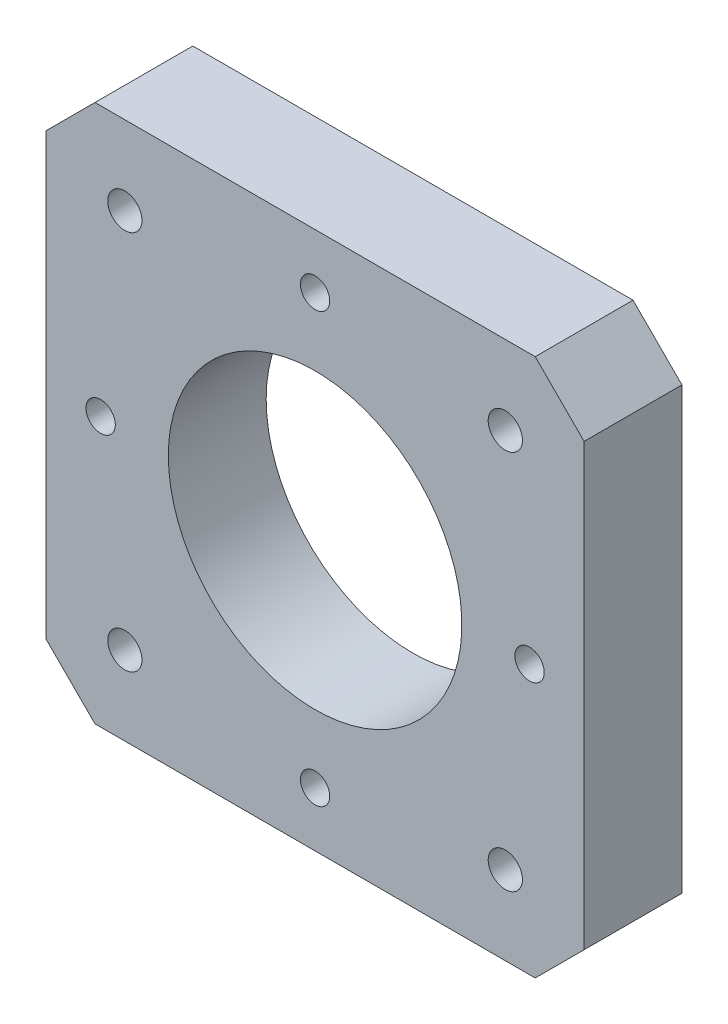
ISO-10303-21;
HEADER;
FILE_DESCRIPTION(('STEP AP214'),'2;1');
FILE_NAME('part.step','',(''),(''),'','','');
FILE_SCHEMA(('AUTOMOTIVE_DESIGN { 1 0 10303 214 1 1 1 1 }'));
ENDSEC;
DATA;
#1=APPLICATION_CONTEXT('core data for automotive mechanical design processes');
#2=APPLICATION_PROTOCOL_DEFINITION('international standard','automotive_design',2000,#1);
#3=PRODUCT_CONTEXT('',#1,'mechanical');
#4=PRODUCT('Part','Part','',(#3));
#5=PRODUCT_RELATED_PRODUCT_CATEGORY('part','',(#4));
#6=PRODUCT_DEFINITION_FORMATION('','',#4);
#7=PRODUCT_DEFINITION_CONTEXT('part definition',#1,'design');
#8=PRODUCT_DEFINITION('design','',#6,#7);
#9=PRODUCT_DEFINITION_SHAPE('','',#8);
#10=(LENGTH_UNIT() NAMED_UNIT(*) SI_UNIT(.MILLI.,.METRE.));
#11=(NAMED_UNIT(*) PLANE_ANGLE_UNIT() SI_UNIT($,.RADIAN.));
#12=(NAMED_UNIT(*) SI_UNIT($,.STERADIAN.) SOLID_ANGLE_UNIT());
#13=UNCERTAINTY_MEASURE_WITH_UNIT(LENGTH_MEASURE(1.E-05),#10,'distance_accuracy_value','');
#14=(GEOMETRIC_REPRESENTATION_CONTEXT(3) GLOBAL_UNCERTAINTY_ASSIGNED_CONTEXT((#13)) GLOBAL_UNIT_ASSIGNED_CONTEXT((#10,
#11,#12)) REPRESENTATION_CONTEXT('',''));
#15=CARTESIAN_POINT('',(0.,0.,0.));
#16=DIRECTION('',(0.,0.,1.));
#17=DIRECTION('',(1.,0.,0.));
#18=AXIS2_PLACEMENT_3D('',#15,#16,#17);
#19=CARTESIAN_POINT('',(-21.920310216783,0.,10.));
#20=DIRECTION('',(0.,0.,-1.));
#21=DIRECTION('',(-1.,0.,0.));
#22=AXIS2_PLACEMENT_3D('',#19,#20,#21);
#23=CYLINDRICAL_SURFACE('',#22,1.5);
#24=CARTESIAN_POINT('',(-21.920310216783,0.,10.));
#25=DIRECTION('',(0.,0.,-1.));
#26=DIRECTION('',(-1.,0.,0.));
#27=AXIS2_PLACEMENT_3D('',#24,#25,#26);
#28=CIRCLE('',#27,1.5);
#29=CARTESIAN_POINT('',(-23.420310216783,0.,10.));
#30=VERTEX_POINT('',#29);
#31=EDGE_CURVE('E155',#30,#30,#28,.T.);
#32=ORIENTED_EDGE('',*,*,#31,.F.);
#33=EDGE_LOOP('',(#32));
#34=FACE_BOUND('',#33,.T.);
#35=CARTESIAN_POINT('',(-21.920310216783,0.,6.));
#36=DIRECTION('',(0.,0.,-1.));
#37=DIRECTION('',(-1.,0.,0.));
#38=AXIS2_PLACEMENT_3D('',#35,#36,#37);
#39=CIRCLE('',#38,1.5);
#40=CARTESIAN_POINT('',(-23.420310216783,0.,6.));
#41=VERTEX_POINT('',#40);
#42=EDGE_CURVE('E152',#41,#41,#39,.F.);
#43=ORIENTED_EDGE('',*,*,#42,.F.);
#44=EDGE_LOOP('',(#43));
#45=FACE_BOUND('',#44,.T.);
#46=ADVANCED_FACE('F40',(#34,#45),#23,.F.);
#47=CARTESIAN_POINT('',(0.,-21.920310216783,10.));
#48=DIRECTION('',(0.,0.,-1.));
#49=DIRECTION('',(-1.,0.,0.));
#50=AXIS2_PLACEMENT_3D('',#47,#48,#49);
#51=CYLINDRICAL_SURFACE('',#50,1.5);
#52=CARTESIAN_POINT('',(0.,-21.920310216783,10.));
#53=DIRECTION('',(0.,0.,-1.));
#54=DIRECTION('',(-1.,0.,0.));
#55=AXIS2_PLACEMENT_3D('',#52,#53,#54);
#56=CIRCLE('',#55,1.5);
#57=CARTESIAN_POINT('',(-1.5,-21.920310216783,10.));
#58=VERTEX_POINT('',#57);
#59=EDGE_CURVE('E222',#58,#58,#56,.T.);
#60=ORIENTED_EDGE('',*,*,#59,.F.);
#61=EDGE_LOOP('',(#60));
#62=FACE_BOUND('',#61,.T.);
#63=CARTESIAN_POINT('',(0.,-21.920310216783,6.));
#64=DIRECTION('',(0.,0.,-1.));
#65=DIRECTION('',(-1.,0.,0.));
#66=AXIS2_PLACEMENT_3D('',#63,#64,#65);
#67=CIRCLE('',#66,1.5);
#68=CARTESIAN_POINT('',(-1.5,-21.920310216783,6.));
#69=VERTEX_POINT('',#68);
#70=EDGE_CURVE('E149',#69,#69,#67,.F.);
#71=ORIENTED_EDGE('',*,*,#70,.F.);
#72=EDGE_LOOP('',(#71));
#73=FACE_BOUND('',#72,.T.);
#74=ADVANCED_FACE('F295',(#62,#73),#51,.F.);
#75=CARTESIAN_POINT('',(21.920310216783,0.,10.));
#76=DIRECTION('',(0.,0.,-1.));
#77=DIRECTION('',(-1.,0.,0.));
#78=AXIS2_PLACEMENT_3D('',#75,#76,#77);
#79=CYLINDRICAL_SURFACE('',#78,1.5);
#80=CARTESIAN_POINT('',(21.920310216783,0.,10.));
#81=DIRECTION('',(0.,0.,-1.));
#82=DIRECTION('',(-1.,0.,0.));
#83=AXIS2_PLACEMENT_3D('',#80,#81,#82);
#84=CIRCLE('',#83,1.5);
#85=CARTESIAN_POINT('',(20.420310216783,0.,10.));
#86=VERTEX_POINT('',#85);
#87=EDGE_CURVE('E225',#86,#86,#84,.T.);
#88=ORIENTED_EDGE('',*,*,#87,.F.);
#89=EDGE_LOOP('',(#88));
#90=FACE_BOUND('',#89,.T.);
#91=CARTESIAN_POINT('',(21.920310216783,0.,6.));
#92=DIRECTION('',(0.,0.,-1.));
#93=DIRECTION('',(-1.,0.,0.));
#94=AXIS2_PLACEMENT_3D('',#91,#92,#93);
#95=CIRCLE('',#94,1.5);
#96=CARTESIAN_POINT('',(20.420310216783,0.,6.));
#97=VERTEX_POINT('',#96);
#98=EDGE_CURVE('E145',#97,#97,#95,.F.);
#99=ORIENTED_EDGE('',*,*,#98,.F.);
#100=EDGE_LOOP('',(#99));
#101=FACE_BOUND('',#100,.T.);
#102=ADVANCED_FACE('F300',(#90,#101),#79,.F.);
#103=CARTESIAN_POINT('',(0.,21.920310216783,10.));
#104=DIRECTION('',(0.,0.,-1.));
#105=DIRECTION('',(-1.,0.,0.));
#106=AXIS2_PLACEMENT_3D('',#103,#104,#105);
#107=CYLINDRICAL_SURFACE('',#106,1.5);
#108=CARTESIAN_POINT('',(0.,21.920310216783,10.));
#109=DIRECTION('',(0.,0.,-1.));
#110=DIRECTION('',(-1.,0.,0.));
#111=AXIS2_PLACEMENT_3D('',#108,#109,#110);
#112=CIRCLE('',#111,1.5);
#113=CARTESIAN_POINT('',(-1.5,21.920310216783,10.));
#114=VERTEX_POINT('',#113);
#115=EDGE_CURVE('E217',#114,#114,#112,.T.);
#116=ORIENTED_EDGE('',*,*,#115,.F.);
#117=EDGE_LOOP('',(#116));
#118=FACE_BOUND('',#117,.T.);
#119=CARTESIAN_POINT('',(0.,21.920310216783,6.));
#120=DIRECTION('',(0.,0.,-1.));
#121=DIRECTION('',(-1.,0.,0.));
#122=AXIS2_PLACEMENT_3D('',#119,#120,#121);
#123=CIRCLE('',#122,1.5);
#124=CARTESIAN_POINT('',(-1.5,21.920310216783,6.));
#125=VERTEX_POINT('',#124);
#126=EDGE_CURVE('E142',#125,#125,#123,.F.);
#127=ORIENTED_EDGE('',*,*,#126,.F.);
#128=EDGE_LOOP('',(#127));
#129=FACE_BOUND('',#128,.T.);
#130=ADVANCED_FACE('F308',(#118,#129),#107,.F.);
#131=CARTESIAN_POINT('',(0.,0.,10.));
#132=DIRECTION('',(0.,0.,1.));
#133=DIRECTION('',(1.,0.,0.));
#134=AXIS2_PLACEMENT_3D('',#131,#132,#133);
#135=PLANE('',#134);
#136=ORIENTED_EDGE('',*,*,#115,.T.);
#137=EDGE_LOOP('',(#136));
#138=FACE_BOUND('',#137,.T.);
#139=ORIENTED_EDGE('',*,*,#87,.T.);
#140=EDGE_LOOP('',(#139));
#141=FACE_BOUND('',#140,.T.);
#142=ORIENTED_EDGE('',*,*,#59,.T.);
#143=EDGE_LOOP('',(#142));
#144=FACE_BOUND('',#143,.T.);
#145=ORIENTED_EDGE('',*,*,#31,.T.);
#146=EDGE_LOOP('',(#145));
#147=FACE_BOUND('',#146,.T.);
#148=CARTESIAN_POINT('',(0.,0.,10.));
#149=DIRECTION('',(0.,0.,-1.));
#150=DIRECTION('',(-1.,0.,0.));
#151=AXIS2_PLACEMENT_3D('',#148,#149,#150);
#152=CIRCLE('',#151,15.);
#153=CARTESIAN_POINT('',(-15.,0.,10.));
#154=VERTEX_POINT('',#153);
#155=EDGE_CURVE('E211',#154,#154,#152,.T.);
#156=ORIENTED_EDGE('',*,*,#155,.T.);
#157=EDGE_LOOP('',(#156));
#158=FACE_BOUND('',#157,.T.);
#159=CARTESIAN_POINT('',(-19.4454364826301,-19.4454364826301,10.));
#160=DIRECTION('',(0.,0.,1.));
#161=DIRECTION('',(1.,0.,0.));
#162=AXIS2_PLACEMENT_3D('',#159,#160,#161);
#163=CIRCLE('',#162,1.75);
#164=CARTESIAN_POINT('',(-17.6954364826301,-19.4454364826301,10.));
#165=VERTEX_POINT('',#164);
#166=EDGE_CURVE('E199',#165,#165,#163,.T.);
#167=ORIENTED_EDGE('',*,*,#166,.F.);
#168=EDGE_LOOP('',(#167));
#169=FACE_BOUND('',#168,.T.);
#170=CARTESIAN_POINT('',(19.4454364826301,19.4454364826301,10.));
#171=DIRECTION('',(0.,0.,1.));
#172=DIRECTION('',(1.,0.,0.));
#173=AXIS2_PLACEMENT_3D('',#170,#171,#172);
#174=CIRCLE('',#173,1.75);
#175=CARTESIAN_POINT('',(21.1954364826301,19.4454364826301,10.));
#176=VERTEX_POINT('',#175);
#177=EDGE_CURVE('E182',#176,#176,#174,.T.);
#178=ORIENTED_EDGE('',*,*,#177,.F.);
#179=EDGE_LOOP('',(#178));
#180=FACE_BOUND('',#179,.T.);
#181=DIRECTION('',(0.,-1.,0.));
#182=VECTOR('',#181,1.);
#183=CARTESIAN_POINT('',(-27.5,27.5,10.));
#184=LINE('',#183,#182);
#185=CARTESIAN_POINT('',(-27.5,22.5,10.));
#186=VERTEX_POINT('',#185);
#187=CARTESIAN_POINT('',(-27.5,-22.5,10.));
#188=VERTEX_POINT('',#187);
#189=EDGE_CURVE('E186',#186,#188,#184,.T.);
#190=ORIENTED_EDGE('',*,*,#189,.T.);
#191=DIRECTION('',(-0.707106781186547,0.707106781186549,0.));
#192=VECTOR('',#191,1.);
#193=CARTESIAN_POINT('',(-25.,-25.,10.));
#194=LINE('',#193,#192);
#195=CARTESIAN_POINT('',(-22.5,-27.5,10.));
#196=VERTEX_POINT('',#195);
#197=EDGE_CURVE('E169',#188,#196,#194,.F.);
#198=ORIENTED_EDGE('',*,*,#197,.T.);
#199=DIRECTION('',(1.,0.,0.));
#200=VECTOR('',#199,1.);
#201=CARTESIAN_POINT('',(-27.5,-27.5,10.));
#202=LINE('',#201,#200);
#203=CARTESIAN_POINT('',(22.5,-27.5,10.));
#204=VERTEX_POINT('',#203);
#205=EDGE_CURVE('E126',#196,#204,#202,.T.);
#206=ORIENTED_EDGE('',*,*,#205,.T.);
#207=DIRECTION('',(-0.707106781186549,-0.707106781186546,0.));
#208=VECTOR('',#207,1.);
#209=CARTESIAN_POINT('',(25.,-25.,10.));
#210=LINE('',#209,#208);
#211=CARTESIAN_POINT('',(27.5,-22.5,10.));
#212=VERTEX_POINT('',#211);
#213=EDGE_CURVE('E167',#204,#212,#210,.F.);
#214=ORIENTED_EDGE('',*,*,#213,.T.);
#215=DIRECTION('',(0.,1.,0.));
#216=VECTOR('',#215,1.);
#217=CARTESIAN_POINT('',(27.5,27.5,10.));
#218=LINE('',#217,#216);
#219=CARTESIAN_POINT('',(27.5,22.5,10.));
#220=VERTEX_POINT('',#219);
#221=EDGE_CURVE('E133',#212,#220,#218,.T.);
#222=ORIENTED_EDGE('',*,*,#221,.T.);
#223=DIRECTION('',(0.707106781186546,-0.707106781186549,0.));
#224=VECTOR('',#223,1.);
#225=CARTESIAN_POINT('',(25.0000000000001,24.9999999999999,10.));
#226=LINE('',#225,#224);
#227=CARTESIAN_POINT('',(22.5,27.5,10.));
#228=VERTEX_POINT('',#227);
#229=EDGE_CURVE('E61',#220,#228,#226,.F.);
#230=ORIENTED_EDGE('',*,*,#229,.T.);
#231=DIRECTION('',(-1.,0.,0.));
#232=VECTOR('',#231,1.);
#233=CARTESIAN_POINT('',(-27.5,27.5,10.));
#234=LINE('',#233,#232);
#235=CARTESIAN_POINT('',(-22.5,27.5,10.));
#236=VERTEX_POINT('',#235);
#237=EDGE_CURVE('E136',#228,#236,#234,.T.);
#238=ORIENTED_EDGE('',*,*,#237,.T.);
#239=DIRECTION('',(0.707106781186549,0.707106781186546,0.));
#240=VECTOR('',#239,1.);
#241=CARTESIAN_POINT('',(-24.9999999999999,25.0000000000001,10.));
#242=LINE('',#241,#240);
#243=EDGE_CURVE('E165',#236,#186,#242,.F.);
#244=ORIENTED_EDGE('',*,*,#243,.T.);
#245=EDGE_LOOP('',(#190,#198,#206,#214,#222,#230,#238,#244));
#246=FACE_BOUND('',#245,.T.);
#247=CARTESIAN_POINT('',(-19.4454364826301,19.4454364826301,10.));
#248=DIRECTION('',(0.,0.,1.));
#249=DIRECTION('',(1.,0.,0.));
#250=AXIS2_PLACEMENT_3D('',#247,#248,#249);
#251=CIRCLE('',#250,1.75);
#252=CARTESIAN_POINT('',(-17.6954364826301,19.4454364826301,10.));
#253=VERTEX_POINT('',#252);
#254=EDGE_CURVE('E193',#253,#253,#251,.T.);
#255=ORIENTED_EDGE('',*,*,#254,.F.);
#256=EDGE_LOOP('',(#255));
#257=FACE_BOUND('',#256,.T.);
#258=CARTESIAN_POINT('',(19.4454364826301,-19.4454364826301,10.));
#259=DIRECTION('',(0.,0.,1.));
#260=DIRECTION('',(1.,0.,0.));
#261=AXIS2_PLACEMENT_3D('',#258,#259,#260);
#262=CIRCLE('',#261,1.75);
#263=CARTESIAN_POINT('',(21.1954364826301,-19.4454364826301,10.));
#264=VERTEX_POINT('',#263);
#265=EDGE_CURVE('E205',#264,#264,#262,.T.);
#266=ORIENTED_EDGE('',*,*,#265,.F.);
#267=EDGE_LOOP('',(#266));
#268=FACE_BOUND('',#267,.T.);
#269=ADVANCED_FACE('F266',(#138,#141,#144,#147,#158,#169,#180,#246,#257,#268),#135,.T.);
#270=CARTESIAN_POINT('',(0.,0.,0.));
#271=DIRECTION('',(0.,0.,1.));
#272=DIRECTION('',(1.,0.,0.));
#273=AXIS2_PLACEMENT_3D('',#270,#271,#272);
#274=PLANE('',#273);
#275=CARTESIAN_POINT('',(-21.920310216783,0.,0.));
#276=DIRECTION('',(0.,0.,-1.));
#277=DIRECTION('',(-1.,0.,0.));
#278=AXIS2_PLACEMENT_3D('',#275,#276,#277);
#279=CIRCLE('',#278,3.25);
#280=CARTESIAN_POINT('',(-25.170310216783,0.,0.));
#281=VERTEX_POINT('',#280);
#282=EDGE_CURVE('E248',#281,#281,#279,.T.);
#283=ORIENTED_EDGE('',*,*,#282,.F.);
#284=EDGE_LOOP('',(#283));
#285=FACE_BOUND('',#284,.T.);
#286=CARTESIAN_POINT('',(0.,-21.920310216783,0.));
#287=DIRECTION('',(0.,0.,-1.));
#288=DIRECTION('',(-1.,0.,0.));
#289=AXIS2_PLACEMENT_3D('',#286,#287,#288);
#290=CIRCLE('',#289,3.25);
#291=CARTESIAN_POINT('',(-3.25,-21.920310216783,0.));
#292=VERTEX_POINT('',#291);
#293=EDGE_CURVE('E242',#292,#292,#290,.T.);
#294=ORIENTED_EDGE('',*,*,#293,.F.);
#295=EDGE_LOOP('',(#294));
#296=FACE_BOUND('',#295,.T.);
#297=CARTESIAN_POINT('',(21.920310216783,0.,0.));
#298=DIRECTION('',(0.,0.,-1.));
#299=DIRECTION('',(-1.,0.,0.));
#300=AXIS2_PLACEMENT_3D('',#297,#298,#299);
#301=CIRCLE('',#300,3.25);
#302=CARTESIAN_POINT('',(18.670310216783,0.,0.));
#303=VERTEX_POINT('',#302);
#304=EDGE_CURVE('E236',#303,#303,#301,.T.);
#305=ORIENTED_EDGE('',*,*,#304,.F.);
#306=EDGE_LOOP('',(#305));
#307=FACE_BOUND('',#306,.T.);
#308=CARTESIAN_POINT('',(0.,21.920310216783,0.));
#309=DIRECTION('',(0.,0.,-1.));
#310=DIRECTION('',(-1.,0.,0.));
#311=AXIS2_PLACEMENT_3D('',#308,#309,#310);
#312=CIRCLE('',#311,3.25);
#313=CARTESIAN_POINT('',(-3.25,21.920310216783,0.));
#314=VERTEX_POINT('',#313);
#315=EDGE_CURVE('E230',#314,#314,#312,.T.);
#316=ORIENTED_EDGE('',*,*,#315,.F.);
#317=EDGE_LOOP('',(#316));
#318=FACE_BOUND('',#317,.T.);
#319=CARTESIAN_POINT('',(0.,0.,0.));
#320=DIRECTION('',(0.,0.,-1.));
#321=DIRECTION('',(-1.,0.,0.));
#322=AXIS2_PLACEMENT_3D('',#319,#320,#321);
#323=CIRCLE('',#322,15.);
#324=CARTESIAN_POINT('',(-15.,0.,0.));
#325=VERTEX_POINT('',#324);
#326=EDGE_CURVE('E214',#325,#325,#323,.T.);
#327=ORIENTED_EDGE('',*,*,#326,.F.);
#328=EDGE_LOOP('',(#327));
#329=FACE_BOUND('',#328,.T.);
#330=DIRECTION('',(1.,0.,0.));
#331=VECTOR('',#330,1.);
#332=CARTESIAN_POINT('',(-27.5,-27.5,0.));
#333=LINE('',#332,#331);
#334=CARTESIAN_POINT('',(-22.5,-27.5,0.));
#335=VERTEX_POINT('',#334);
#336=CARTESIAN_POINT('',(22.5,-27.5,0.));
#337=VERTEX_POINT('',#336);
#338=EDGE_CURVE('E123',#335,#337,#333,.T.);
#339=ORIENTED_EDGE('',*,*,#338,.F.);
#340=DIRECTION('',(0.707106781186547,-0.707106781186549,0.));
#341=VECTOR('',#340,1.);
#342=CARTESIAN_POINT('',(-22.5,-27.5,0.));
#343=LINE('',#342,#341);
#344=CARTESIAN_POINT('',(-27.5,-22.5,0.));
#345=VERTEX_POINT('',#344);
#346=EDGE_CURVE('E106',#335,#345,#343,.F.);
#347=ORIENTED_EDGE('',*,*,#346,.T.);
#348=DIRECTION('',(0.,-1.,0.));
#349=VECTOR('',#348,1.);
#350=CARTESIAN_POINT('',(-27.5,27.5,0.));
#351=LINE('',#350,#349);
#352=CARTESIAN_POINT('',(-27.5,22.5,0.));
#353=VERTEX_POINT('',#352);
#354=EDGE_CURVE('E134',#353,#345,#351,.T.);
#355=ORIENTED_EDGE('',*,*,#354,.F.);
#356=DIRECTION('',(-0.707106781186549,-0.707106781186546,0.));
#357=VECTOR('',#356,1.);
#358=CARTESIAN_POINT('',(-27.5,22.5,0.));
#359=LINE('',#358,#357);
#360=CARTESIAN_POINT('',(-22.5,27.5,0.));
#361=VERTEX_POINT('',#360);
#362=EDGE_CURVE('E158',#353,#361,#359,.F.);
#363=ORIENTED_EDGE('',*,*,#362,.T.);
#364=DIRECTION('',(-1.,0.,0.));
#365=VECTOR('',#364,1.);
#366=CARTESIAN_POINT('',(-27.5,27.5,0.));
#367=LINE('',#366,#365);
#368=CARTESIAN_POINT('',(22.5,27.5,0.));
#369=VERTEX_POINT('',#368);
#370=EDGE_CURVE('E138',#369,#361,#367,.T.);
#371=ORIENTED_EDGE('',*,*,#370,.F.);
#372=DIRECTION('',(-0.707106781186546,0.707106781186549,0.));
#373=VECTOR('',#372,1.);
#374=CARTESIAN_POINT('',(22.5,27.5,0.));
#375=LINE('',#374,#373);
#376=CARTESIAN_POINT('',(27.5,22.5,0.));
#377=VERTEX_POINT('',#376);
#378=EDGE_CURVE('E127',#369,#377,#375,.F.);
#379=ORIENTED_EDGE('',*,*,#378,.T.);
#380=DIRECTION('',(0.,1.,0.));
#381=VECTOR('',#380,1.);
#382=CARTESIAN_POINT('',(27.5,27.5,0.));
#383=LINE('',#382,#381);
#384=CARTESIAN_POINT('',(27.5,-22.5,0.));
#385=VERTEX_POINT('',#384);
#386=EDGE_CURVE('E181',#385,#377,#383,.T.);
#387=ORIENTED_EDGE('',*,*,#386,.F.);
#388=DIRECTION('',(0.707106781186549,0.707106781186546,0.));
#389=VECTOR('',#388,1.);
#390=CARTESIAN_POINT('',(27.5,-22.5,0.));
#391=LINE('',#390,#389);
#392=EDGE_CURVE('E117',#385,#337,#391,.F.);
#393=ORIENTED_EDGE('',*,*,#392,.T.);
#394=EDGE_LOOP('',(#339,#347,#355,#363,#371,#379,#387,#393));
#395=FACE_BOUND('',#394,.T.);
#396=CARTESIAN_POINT('',(19.4454364826301,19.4454364826301,0.));
#397=DIRECTION('',(0.,0.,1.));
#398=DIRECTION('',(1.,0.,0.));
#399=AXIS2_PLACEMENT_3D('',#396,#397,#398);
#400=CIRCLE('',#399,1.75);
#401=CARTESIAN_POINT('',(21.1954364826301,19.4454364826301,0.));
#402=VERTEX_POINT('',#401);
#403=EDGE_CURVE('E190',#402,#402,#400,.T.);
#404=ORIENTED_EDGE('',*,*,#403,.T.);
#405=EDGE_LOOP('',(#404));
#406=FACE_BOUND('',#405,.T.);
#407=CARTESIAN_POINT('',(-19.4454364826301,19.4454364826301,0.));
#408=DIRECTION('',(0.,0.,1.));
#409=DIRECTION('',(1.,0.,0.));
#410=AXIS2_PLACEMENT_3D('',#407,#408,#409);
#411=CIRCLE('',#410,1.75);
#412=CARTESIAN_POINT('',(-17.6954364826301,19.4454364826301,0.));
#413=VERTEX_POINT('',#412);
#414=EDGE_CURVE('E196',#413,#413,#411,.T.);
#415=ORIENTED_EDGE('',*,*,#414,.T.);
#416=EDGE_LOOP('',(#415));
#417=FACE_BOUND('',#416,.T.);
#418=CARTESIAN_POINT('',(-19.4454364826301,-19.4454364826301,0.));
#419=DIRECTION('',(0.,0.,1.));
#420=DIRECTION('',(1.,0.,0.));
#421=AXIS2_PLACEMENT_3D('',#418,#419,#420);
#422=CIRCLE('',#421,1.75);
#423=CARTESIAN_POINT('',(-17.6954364826301,-19.4454364826301,0.));
#424=VERTEX_POINT('',#423);
#425=EDGE_CURVE('E202',#424,#424,#422,.T.);
#426=ORIENTED_EDGE('',*,*,#425,.T.);
#427=EDGE_LOOP('',(#426));
#428=FACE_BOUND('',#427,.T.);
#429=CARTESIAN_POINT('',(19.4454364826301,-19.4454364826301,0.));
#430=DIRECTION('',(0.,0.,1.));
#431=DIRECTION('',(1.,0.,0.));
#432=AXIS2_PLACEMENT_3D('',#429,#430,#431);
#433=CIRCLE('',#432,1.75);
#434=CARTESIAN_POINT('',(21.1954364826301,-19.4454364826301,0.));
#435=VERTEX_POINT('',#434);
#436=EDGE_CURVE('E208',#435,#435,#433,.T.);
#437=ORIENTED_EDGE('',*,*,#436,.T.);
#438=EDGE_LOOP('',(#437));
#439=FACE_BOUND('',#438,.T.);
#440=ADVANCED_FACE('F130',(#285,#296,#307,#318,#329,#395,#406,#417,#428,#439),#274,.F.);
#441=CARTESIAN_POINT('',(27.5,27.5,10.));
#442=DIRECTION('',(-1.,0.,0.));
#443=DIRECTION('',(0.,-1.,0.));
#444=AXIS2_PLACEMENT_3D('',#441,#442,#443);
#445=PLANE('',#444);
#446=ORIENTED_EDGE('',*,*,#221,.F.);
#447=DIRECTION('',(0.,0.,-1.));
#448=VECTOR('',#447,1.);
#449=CARTESIAN_POINT('',(27.5,-22.5,10.));
#450=LINE('',#449,#448);
#451=EDGE_CURVE('E173',#212,#385,#450,.T.);
#452=ORIENTED_EDGE('',*,*,#451,.T.);
#453=ORIENTED_EDGE('',*,*,#386,.T.);
#454=DIRECTION('',(0.,0.,1.));
#455=VECTOR('',#454,1.);
#456=CARTESIAN_POINT('',(27.5,22.5,10.));
#457=LINE('',#456,#455);
#458=EDGE_CURVE('E171',#377,#220,#457,.T.);
#459=ORIENTED_EDGE('',*,*,#458,.T.);
#460=EDGE_LOOP('',(#446,#452,#453,#459));
#461=FACE_BOUND('',#460,.T.);
#462=ADVANCED_FACE('F265',(#461),#445,.F.);
#463=CARTESIAN_POINT('',(-27.5,27.5,10.));
#464=DIRECTION('',(0.,-1.,0.));
#465=DIRECTION('',(1.,0.,0.));
#466=AXIS2_PLACEMENT_3D('',#463,#464,#465);
#467=PLANE('',#466);
#468=ORIENTED_EDGE('',*,*,#370,.T.);
#469=DIRECTION('',(0.,0.,1.));
#470=VECTOR('',#469,1.);
#471=CARTESIAN_POINT('',(-22.5,27.5,10.));
#472=LINE('',#471,#470);
#473=EDGE_CURVE('E11',#361,#236,#472,.T.);
#474=ORIENTED_EDGE('',*,*,#473,.T.);
#475=ORIENTED_EDGE('',*,*,#237,.F.);
#476=DIRECTION('',(0.,0.,-1.));
#477=VECTOR('',#476,1.);
#478=CARTESIAN_POINT('',(22.5,27.5,10.));
#479=LINE('',#478,#477);
#480=EDGE_CURVE('E49',#228,#369,#479,.T.);
#481=ORIENTED_EDGE('',*,*,#480,.T.);
#482=EDGE_LOOP('',(#468,#474,#475,#481));
#483=FACE_BOUND('',#482,.T.);
#484=ADVANCED_FACE('F178',(#483),#467,.F.);
#485=CARTESIAN_POINT('',(-27.5,27.5,10.));
#486=DIRECTION('',(1.,0.,0.));
#487=DIRECTION('',(0.,0.,-1.));
#488=AXIS2_PLACEMENT_3D('',#485,#486,#487);
#489=PLANE('',#488);
#490=ORIENTED_EDGE('',*,*,#354,.T.);
#491=DIRECTION('',(0.,0.,1.));
#492=VECTOR('',#491,1.);
#493=CARTESIAN_POINT('',(-27.5,-22.5,10.));
#494=LINE('',#493,#492);
#495=EDGE_CURVE('E111',#345,#188,#494,.T.);
#496=ORIENTED_EDGE('',*,*,#495,.T.);
#497=ORIENTED_EDGE('',*,*,#189,.F.);
#498=DIRECTION('',(0.,0.,-1.));
#499=VECTOR('',#498,1.);
#500=CARTESIAN_POINT('',(-27.5,22.5,10.));
#501=LINE('',#500,#499);
#502=EDGE_CURVE('E116',#186,#353,#501,.T.);
#503=ORIENTED_EDGE('',*,*,#502,.T.);
#504=EDGE_LOOP('',(#490,#496,#497,#503));
#505=FACE_BOUND('',#504,.T.);
#506=ADVANCED_FACE('F475',(#505),#489,.F.);
#507=CARTESIAN_POINT('',(-27.5,-27.5,10.));
#508=DIRECTION('',(0.,1.,0.));
#509=DIRECTION('',(0.,0.,1.));
#510=AXIS2_PLACEMENT_3D('',#507,#508,#509);
#511=PLANE('',#510);
#512=ORIENTED_EDGE('',*,*,#205,.F.);
#513=DIRECTION('',(0.,0.,-1.));
#514=VECTOR('',#513,1.);
#515=CARTESIAN_POINT('',(-22.5,-27.5,10.));
#516=LINE('',#515,#514);
#517=EDGE_CURVE('E110',#196,#335,#516,.T.);
#518=ORIENTED_EDGE('',*,*,#517,.T.);
#519=ORIENTED_EDGE('',*,*,#338,.T.);
#520=DIRECTION('',(0.,0.,1.));
#521=VECTOR('',#520,1.);
#522=CARTESIAN_POINT('',(22.5,-27.5,10.));
#523=LINE('',#522,#521);
#524=EDGE_CURVE('E128',#337,#204,#523,.T.);
#525=ORIENTED_EDGE('',*,*,#524,.T.);
#526=EDGE_LOOP('',(#512,#518,#519,#525));
#527=FACE_BOUND('',#526,.T.);
#528=ADVANCED_FACE('F122',(#527),#511,.F.);
#529=CARTESIAN_POINT('',(19.4454364826301,19.4454364826301,10.));
#530=DIRECTION('',(0.,0.,-1.));
#531=DIRECTION('',(-1.,0.,0.));
#532=AXIS2_PLACEMENT_3D('',#529,#530,#531);
#533=CYLINDRICAL_SURFACE('',#532,1.75);
#534=ORIENTED_EDGE('',*,*,#177,.T.);
#535=EDGE_LOOP('',(#534));
#536=FACE_BOUND('',#535,.T.);
#537=ORIENTED_EDGE('',*,*,#403,.F.);
#538=EDGE_LOOP('',(#537));
#539=FACE_BOUND('',#538,.T.);
#540=ADVANCED_FACE('F457',(#536,#539),#533,.F.);
#541=CARTESIAN_POINT('',(-19.4454364826301,19.4454364826301,10.));
#542=DIRECTION('',(0.,0.,-1.));
#543=DIRECTION('',(-1.,0.,0.));
#544=AXIS2_PLACEMENT_3D('',#541,#542,#543);
#545=CYLINDRICAL_SURFACE('',#544,1.75);
#546=ORIENTED_EDGE('',*,*,#254,.T.);
#547=EDGE_LOOP('',(#546));
#548=FACE_BOUND('',#547,.T.);
#549=ORIENTED_EDGE('',*,*,#414,.F.);
#550=EDGE_LOOP('',(#549));
#551=FACE_BOUND('',#550,.T.);
#552=ADVANCED_FACE('F447',(#548,#551),#545,.F.);
#553=CARTESIAN_POINT('',(-19.4454364826301,-19.4454364826301,10.));
#554=DIRECTION('',(0.,0.,-1.));
#555=DIRECTION('',(-1.,0.,0.));
#556=AXIS2_PLACEMENT_3D('',#553,#554,#555);
#557=CYLINDRICAL_SURFACE('',#556,1.75);
#558=ORIENTED_EDGE('',*,*,#166,.T.);
#559=EDGE_LOOP('',(#558));
#560=FACE_BOUND('',#559,.T.);
#561=ORIENTED_EDGE('',*,*,#425,.F.);
#562=EDGE_LOOP('',(#561));
#563=FACE_BOUND('',#562,.T.);
#564=ADVANCED_FACE('F289',(#560,#563),#557,.F.);
#565=CARTESIAN_POINT('',(19.4454364826301,-19.4454364826301,10.));
#566=DIRECTION('',(0.,0.,-1.));
#567=DIRECTION('',(-1.,0.,0.));
#568=AXIS2_PLACEMENT_3D('',#565,#566,#567);
#569=CYLINDRICAL_SURFACE('',#568,1.75);
#570=ORIENTED_EDGE('',*,*,#265,.T.);
#571=EDGE_LOOP('',(#570));
#572=FACE_BOUND('',#571,.T.);
#573=ORIENTED_EDGE('',*,*,#436,.F.);
#574=EDGE_LOOP('',(#573));
#575=FACE_BOUND('',#574,.T.);
#576=ADVANCED_FACE('F279',(#572,#575),#569,.F.);
#577=CARTESIAN_POINT('',(0.,0.,10.));
#578=DIRECTION('',(0.,0.,-1.));
#579=DIRECTION('',(-1.,0.,0.));
#580=AXIS2_PLACEMENT_3D('',#577,#578,#579);
#581=CYLINDRICAL_SURFACE('',#580,15.);
#582=ORIENTED_EDGE('',*,*,#155,.F.);
#583=EDGE_LOOP('',(#582));
#584=FACE_BOUND('',#583,.T.);
#585=ORIENTED_EDGE('',*,*,#326,.T.);
#586=EDGE_LOOP('',(#585));
#587=FACE_BOUND('',#586,.T.);
#588=ADVANCED_FACE('F276',(#584,#587),#581,.F.);
#589=CARTESIAN_POINT('',(0.,21.920310216783,6.));
#590=DIRECTION('',(0.,0.,-1.));
#591=DIRECTION('',(-1.,0.,0.));
#592=AXIS2_PLACEMENT_3D('',#589,#590,#591);
#593=PLANE('',#592);
#594=CARTESIAN_POINT('',(0.,21.920310216783,6.));
#595=DIRECTION('',(0.,0.,-1.));
#596=DIRECTION('',(-1.,0.,0.));
#597=AXIS2_PLACEMENT_3D('',#594,#595,#596);
#598=CIRCLE('',#597,3.25);
#599=CARTESIAN_POINT('',(-3.25,21.920310216783,6.));
#600=VERTEX_POINT('',#599);
#601=EDGE_CURVE('E233',#600,#600,#598,.T.);
#602=ORIENTED_EDGE('',*,*,#601,.T.);
#603=EDGE_LOOP('',(#602));
#604=FACE_BOUND('',#603,.T.);
#605=ORIENTED_EDGE('',*,*,#126,.T.);
#606=EDGE_LOOP('',(#605));
#607=FACE_BOUND('',#606,.T.);
#608=ADVANCED_FACE('F278',(#604,#607),#593,.T.);
#609=CARTESIAN_POINT('',(0.,21.920310216783,6.));
#610=DIRECTION('',(0.,0.,-1.));
#611=DIRECTION('',(-1.,0.,0.));
#612=AXIS2_PLACEMENT_3D('',#609,#610,#611);
#613=CYLINDRICAL_SURFACE('',#612,3.25);
#614=ORIENTED_EDGE('',*,*,#601,.F.);
#615=EDGE_LOOP('',(#614));
#616=FACE_BOUND('',#615,.T.);
#617=ORIENTED_EDGE('',*,*,#315,.T.);
#618=EDGE_LOOP('',(#617));
#619=FACE_BOUND('',#618,.T.);
#620=ADVANCED_FACE('F286',(#616,#619),#613,.F.);
#621=CARTESIAN_POINT('',(21.920310216783,0.,6.));
#622=DIRECTION('',(0.,0.,-1.));
#623=DIRECTION('',(-1.,0.,0.));
#624=AXIS2_PLACEMENT_3D('',#621,#622,#623);
#625=PLANE('',#624);
#626=CARTESIAN_POINT('',(21.920310216783,0.,6.));
#627=DIRECTION('',(0.,0.,-1.));
#628=DIRECTION('',(-1.,0.,0.));
#629=AXIS2_PLACEMENT_3D('',#626,#627,#628);
#630=CIRCLE('',#629,3.25);
#631=CARTESIAN_POINT('',(18.670310216783,0.,6.));
#632=VERTEX_POINT('',#631);
#633=EDGE_CURVE('E239',#632,#632,#630,.T.);
#634=ORIENTED_EDGE('',*,*,#633,.T.);
#635=EDGE_LOOP('',(#634));
#636=FACE_BOUND('',#635,.T.);
#637=ORIENTED_EDGE('',*,*,#98,.T.);
#638=EDGE_LOOP('',(#637));
#639=FACE_BOUND('',#638,.T.);
#640=ADVANCED_FACE('F314',(#636,#639),#625,.T.);
#641=CARTESIAN_POINT('',(21.920310216783,0.,6.));
#642=DIRECTION('',(0.,0.,-1.));
#643=DIRECTION('',(-1.,0.,0.));
#644=AXIS2_PLACEMENT_3D('',#641,#642,#643);
#645=CYLINDRICAL_SURFACE('',#644,3.25);
#646=ORIENTED_EDGE('',*,*,#633,.F.);
#647=EDGE_LOOP('',(#646));
#648=FACE_BOUND('',#647,.T.);
#649=ORIENTED_EDGE('',*,*,#304,.T.);
#650=EDGE_LOOP('',(#649));
#651=FACE_BOUND('',#650,.T.);
#652=ADVANCED_FACE('F317',(#648,#651),#645,.F.);
#653=CARTESIAN_POINT('',(0.,-21.920310216783,6.));
#654=DIRECTION('',(0.,0.,-1.));
#655=DIRECTION('',(-1.,0.,0.));
#656=AXIS2_PLACEMENT_3D('',#653,#654,#655);
#657=PLANE('',#656);
#658=CARTESIAN_POINT('',(0.,-21.920310216783,6.));
#659=DIRECTION('',(0.,0.,-1.));
#660=DIRECTION('',(-1.,0.,0.));
#661=AXIS2_PLACEMENT_3D('',#658,#659,#660);
#662=CIRCLE('',#661,3.25);
#663=CARTESIAN_POINT('',(-3.25,-21.920310216783,6.));
#664=VERTEX_POINT('',#663);
#665=EDGE_CURVE('E245',#664,#664,#662,.T.);
#666=ORIENTED_EDGE('',*,*,#665,.T.);
#667=EDGE_LOOP('',(#666));
#668=FACE_BOUND('',#667,.T.);
#669=ORIENTED_EDGE('',*,*,#70,.T.);
#670=EDGE_LOOP('',(#669));
#671=FACE_BOUND('',#670,.T.);
#672=ADVANCED_FACE('F320',(#668,#671),#657,.T.);
#673=CARTESIAN_POINT('',(0.,-21.920310216783,6.));
#674=DIRECTION('',(0.,0.,-1.));
#675=DIRECTION('',(-1.,0.,0.));
#676=AXIS2_PLACEMENT_3D('',#673,#674,#675);
#677=CYLINDRICAL_SURFACE('',#676,3.25);
#678=ORIENTED_EDGE('',*,*,#665,.F.);
#679=EDGE_LOOP('',(#678));
#680=FACE_BOUND('',#679,.T.);
#681=ORIENTED_EDGE('',*,*,#293,.T.);
#682=EDGE_LOOP('',(#681));
#683=FACE_BOUND('',#682,.T.);
#684=ADVANCED_FACE('F325',(#680,#683),#677,.F.);
#685=CARTESIAN_POINT('',(-21.920310216783,0.,6.));
#686=DIRECTION('',(0.,0.,-1.));
#687=DIRECTION('',(-1.,0.,0.));
#688=AXIS2_PLACEMENT_3D('',#685,#686,#687);
#689=PLANE('',#688);
#690=CARTESIAN_POINT('',(-21.920310216783,0.,6.));
#691=DIRECTION('',(0.,0.,-1.));
#692=DIRECTION('',(-1.,0.,0.));
#693=AXIS2_PLACEMENT_3D('',#690,#691,#692);
#694=CIRCLE('',#693,3.25);
#695=CARTESIAN_POINT('',(-25.170310216783,0.,6.));
#696=VERTEX_POINT('',#695);
#697=EDGE_CURVE('E146',#696,#696,#694,.T.);
#698=ORIENTED_EDGE('',*,*,#697,.T.);
#699=EDGE_LOOP('',(#698));
#700=FACE_BOUND('',#699,.T.);
#701=ORIENTED_EDGE('',*,*,#42,.T.);
#702=EDGE_LOOP('',(#701));
#703=FACE_BOUND('',#702,.T.);
#704=ADVANCED_FACE('F254',(#700,#703),#689,.T.);
#705=CARTESIAN_POINT('',(-21.920310216783,0.,6.));
#706=DIRECTION('',(0.,0.,-1.));
#707=DIRECTION('',(-1.,0.,0.));
#708=AXIS2_PLACEMENT_3D('',#705,#706,#707);
#709=CYLINDRICAL_SURFACE('',#708,3.25);
#710=ORIENTED_EDGE('',*,*,#697,.F.);
#711=EDGE_LOOP('',(#710));
#712=FACE_BOUND('',#711,.T.);
#713=ORIENTED_EDGE('',*,*,#282,.T.);
#714=EDGE_LOOP('',(#713));
#715=FACE_BOUND('',#714,.T.);
#716=ADVANCED_FACE('F257',(#712,#715),#709,.F.);
#717=CARTESIAN_POINT('',(-22.5,-27.5,10.));
#718=DIRECTION('',(0.707106781186549,0.707106781186547,0.));
#719=DIRECTION('',(0.,0.,-1.));
#720=AXIS2_PLACEMENT_3D('',#717,#718,#719);
#721=PLANE('',#720);
#722=ORIENTED_EDGE('',*,*,#197,.F.);
#723=ORIENTED_EDGE('',*,*,#495,.F.);
#724=ORIENTED_EDGE('',*,*,#346,.F.);
#725=ORIENTED_EDGE('',*,*,#517,.F.);
#726=EDGE_LOOP('',(#722,#723,#724,#725));
#727=FACE_BOUND('',#726,.T.);
#728=ADVANCED_FACE('F109',(#727),#721,.F.);
#729=CARTESIAN_POINT('',(27.5,-22.5,10.));
#730=DIRECTION('',(-0.707106781186546,0.707106781186549,0.));
#731=DIRECTION('',(0.,0.,-1.));
#732=AXIS2_PLACEMENT_3D('',#729,#730,#731);
#733=PLANE('',#732);
#734=ORIENTED_EDGE('',*,*,#213,.F.);
#735=ORIENTED_EDGE('',*,*,#524,.F.);
#736=ORIENTED_EDGE('',*,*,#392,.F.);
#737=ORIENTED_EDGE('',*,*,#451,.F.);
#738=EDGE_LOOP('',(#734,#735,#736,#737));
#739=FACE_BOUND('',#738,.T.);
#740=ADVANCED_FACE('F348',(#739),#733,.F.);
#741=CARTESIAN_POINT('',(-27.5,22.5,10.));
#742=DIRECTION('',(0.707106781186546,-0.707106781186549,0.));
#743=DIRECTION('',(0.,0.,-1.));
#744=AXIS2_PLACEMENT_3D('',#741,#742,#743);
#745=PLANE('',#744);
#746=ORIENTED_EDGE('',*,*,#243,.F.);
#747=ORIENTED_EDGE('',*,*,#473,.F.);
#748=ORIENTED_EDGE('',*,*,#362,.F.);
#749=ORIENTED_EDGE('',*,*,#502,.F.);
#750=EDGE_LOOP('',(#746,#747,#748,#749));
#751=FACE_BOUND('',#750,.T.);
#752=ADVANCED_FACE('F356',(#751),#745,.F.);
#753=CARTESIAN_POINT('',(22.5,27.5,10.));
#754=DIRECTION('',(-0.707106781186549,-0.707106781186546,0.));
#755=DIRECTION('',(0.,0.,-1.));
#756=AXIS2_PLACEMENT_3D('',#753,#754,#755);
#757=PLANE('',#756);
#758=ORIENTED_EDGE('',*,*,#229,.F.);
#759=ORIENTED_EDGE('',*,*,#458,.F.);
#760=ORIENTED_EDGE('',*,*,#378,.F.);
#761=ORIENTED_EDGE('',*,*,#480,.F.);
#762=EDGE_LOOP('',(#758,#759,#760,#761));
#763=FACE_BOUND('',#762,.T.);
#764=ADVANCED_FACE('F43',(#763),#757,.F.);
#765=CLOSED_SHELL('',(#46,#74,#102,#130,#269,#440,#462,#484,#506,#528,#540,#552,#564,#576,#588,
#608,#620,#640,#652,#672,#684,#704,#716,#728,#740,#752,#764));
#766=MANIFOLD_SOLID_BREP('B2',#765);
#767=ADVANCED_BREP_SHAPE_REPRESENTATION('',(#18,#766),#14);
#768=SHAPE_DEFINITION_REPRESENTATION(#9,#767);
ENDSEC;
END-ISO-10303-21;
